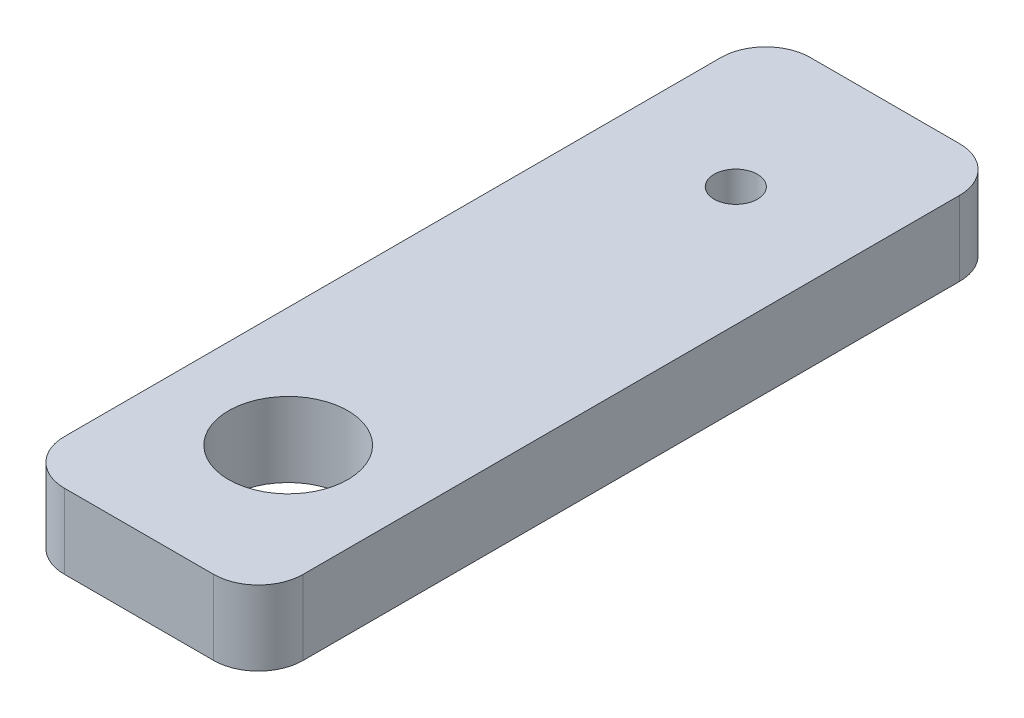
ISO-10303-21;
HEADER;
FILE_DESCRIPTION(('STEP AP214'),'2;1');
FILE_NAME('part.step','',(''),(''),'','','');
FILE_SCHEMA(('AUTOMOTIVE_DESIGN { 1 0 10303 214 1 1 1 1 }'));
ENDSEC;
DATA;
#1=APPLICATION_CONTEXT('core data for automotive mechanical design processes');
#2=APPLICATION_PROTOCOL_DEFINITION('international standard','automotive_design',2000,#1);
#3=PRODUCT_CONTEXT('',#1,'mechanical');
#4=PRODUCT('Part','Part','',(#3));
#5=PRODUCT_RELATED_PRODUCT_CATEGORY('part','',(#4));
#6=PRODUCT_DEFINITION_FORMATION('','',#4);
#7=PRODUCT_DEFINITION_CONTEXT('part definition',#1,'design');
#8=PRODUCT_DEFINITION('design','',#6,#7);
#9=PRODUCT_DEFINITION_SHAPE('','',#8);
#10=(LENGTH_UNIT() NAMED_UNIT(*) SI_UNIT(.MILLI.,.METRE.));
#11=(NAMED_UNIT(*) PLANE_ANGLE_UNIT() SI_UNIT($,.RADIAN.));
#12=(NAMED_UNIT(*) SI_UNIT($,.STERADIAN.) SOLID_ANGLE_UNIT());
#13=UNCERTAINTY_MEASURE_WITH_UNIT(LENGTH_MEASURE(1.E-05),#10,'distance_accuracy_value','');
#14=(GEOMETRIC_REPRESENTATION_CONTEXT(3) GLOBAL_UNCERTAINTY_ASSIGNED_CONTEXT((#13)) GLOBAL_UNIT_ASSIGNED_CONTEXT((#10,
#11,#12)) REPRESENTATION_CONTEXT('',''));
#15=CARTESIAN_POINT('',(0.,0.,0.));
#16=DIRECTION('',(0.,0.,1.));
#17=DIRECTION('',(1.,0.,0.));
#18=AXIS2_PLACEMENT_3D('',#15,#16,#17);
#19=CARTESIAN_POINT('',(0.,5.,0.));
#20=DIRECTION('',(0.,-1.,0.));
#21=DIRECTION('',(0.,0.,-1.));
#22=AXIS2_PLACEMENT_3D('',#19,#20,#21);
#23=PLANE('',#22);
#24=DIRECTION('',(0.,0.,-1.));
#25=VECTOR('',#24,1.);
#26=CARTESIAN_POINT('',(16.,5.,0.));
#27=LINE('',#26,#25);
#28=CARTESIAN_POINT('',(16.,5.,-3.));
#29=VERTEX_POINT('',#28);
#30=CARTESIAN_POINT('',(16.,5.,-47.));
#31=VERTEX_POINT('',#30);
#32=EDGE_CURVE('E164',#29,#31,#27,.T.);
#33=ORIENTED_EDGE('',*,*,#32,.T.);
#34=CARTESIAN_POINT('',(13.,5.,-47.));
#35=DIRECTION('',(0.,-1.,0.));
#36=DIRECTION('',(0.,0.,-1.));
#37=AXIS2_PLACEMENT_3D('',#34,#35,#36);
#38=CIRCLE('',#37,3.);
#39=CARTESIAN_POINT('',(13.,5.,-50.));
#40=VERTEX_POINT('',#39);
#41=EDGE_CURVE('E147',#31,#40,#38,.F.);
#42=ORIENTED_EDGE('',*,*,#41,.T.);
#43=DIRECTION('',(-1.,0.,0.));
#44=VECTOR('',#43,1.);
#45=CARTESIAN_POINT('',(0.,5.,-50.));
#46=LINE('',#45,#44);
#47=CARTESIAN_POINT('',(3.,5.,-50.));
#48=VERTEX_POINT('',#47);
#49=EDGE_CURVE('E118',#40,#48,#46,.T.);
#50=ORIENTED_EDGE('',*,*,#49,.T.);
#51=CARTESIAN_POINT('',(3.,5.,-47.));
#52=DIRECTION('',(0.,-1.,0.));
#53=DIRECTION('',(0.,0.,-1.));
#54=AXIS2_PLACEMENT_3D('',#51,#52,#53);
#55=CIRCLE('',#54,3.);
#56=CARTESIAN_POINT('',(0.,5.,-47.));
#57=VERTEX_POINT('',#56);
#58=EDGE_CURVE('E145',#48,#57,#55,.F.);
#59=ORIENTED_EDGE('',*,*,#58,.T.);
#60=DIRECTION('',(0.,0.,1.));
#61=VECTOR('',#60,1.);
#62=CARTESIAN_POINT('',(0.,5.,0.));
#63=LINE('',#62,#61);
#64=CARTESIAN_POINT('',(0.,5.,-3.));
#65=VERTEX_POINT('',#64);
#66=EDGE_CURVE('E125',#57,#65,#63,.T.);
#67=ORIENTED_EDGE('',*,*,#66,.T.);
#68=CARTESIAN_POINT('',(3.,5.,-3.));
#69=DIRECTION('',(0.,-1.,0.));
#70=DIRECTION('',(0.,0.,-1.));
#71=AXIS2_PLACEMENT_3D('',#68,#69,#70);
#72=CIRCLE('',#71,3.);
#73=CARTESIAN_POINT('',(3.,5.,0.));
#74=VERTEX_POINT('',#73);
#75=EDGE_CURVE('E53',#65,#74,#72,.F.);
#76=ORIENTED_EDGE('',*,*,#75,.T.);
#77=DIRECTION('',(1.,0.,0.));
#78=VECTOR('',#77,1.);
#79=CARTESIAN_POINT('',(0.,5.,0.));
#80=LINE('',#79,#78);
#81=CARTESIAN_POINT('',(13.,5.,0.));
#82=VERTEX_POINT('',#81);
#83=EDGE_CURVE('E128',#74,#82,#80,.T.);
#84=ORIENTED_EDGE('',*,*,#83,.T.);
#85=CARTESIAN_POINT('',(13.,5.,-3.));
#86=DIRECTION('',(0.,-1.,0.));
#87=DIRECTION('',(0.,0.,-1.));
#88=AXIS2_PLACEMENT_3D('',#85,#86,#87);
#89=CIRCLE('',#88,3.);
#90=EDGE_CURVE('E143',#82,#29,#89,.F.);
#91=ORIENTED_EDGE('',*,*,#90,.T.);
#92=EDGE_LOOP('',(#33,#42,#50,#59,#67,#76,#84,#91));
#93=FACE_BOUND('',#92,.T.);
#94=CARTESIAN_POINT('',(8.,5.,-40.));
#95=DIRECTION('',(0.,1.,0.));
#96=DIRECTION('',(0.,0.,1.));
#97=AXIS2_PLACEMENT_3D('',#94,#95,#96);
#98=CIRCLE('',#97,1.45);
#99=CARTESIAN_POINT('',(8.,5.,-38.55));
#100=VERTEX_POINT('',#99);
#101=EDGE_CURVE('E160',#100,#100,#98,.T.);
#102=ORIENTED_EDGE('',*,*,#101,.F.);
#103=EDGE_LOOP('',(#102));
#104=FACE_BOUND('',#103,.T.);
#105=CARTESIAN_POINT('',(8.,5.,-10.));
#106=DIRECTION('',(0.,1.,0.));
#107=DIRECTION('',(0.,0.,1.));
#108=AXIS2_PLACEMENT_3D('',#105,#106,#107);
#109=CIRCLE('',#108,4.);
#110=CARTESIAN_POINT('',(8.,5.,-6.));
#111=VERTEX_POINT('',#110);
#112=EDGE_CURVE('E171',#111,#111,#109,.T.);
#113=ORIENTED_EDGE('',*,*,#112,.F.);
#114=EDGE_LOOP('',(#113));
#115=FACE_BOUND('',#114,.T.);
#116=ADVANCED_FACE('F33',(#93,#104,#115),#23,.F.);
#117=CARTESIAN_POINT('',(0.,0.,0.));
#118=DIRECTION('',(0.,-1.,0.));
#119=DIRECTION('',(0.,0.,-1.));
#120=AXIS2_PLACEMENT_3D('',#117,#118,#119);
#121=PLANE('',#120);
#122=CARTESIAN_POINT('',(8.,0.,-40.));
#123=DIRECTION('',(0.,1.,0.));
#124=DIRECTION('',(0.,0.,1.));
#125=AXIS2_PLACEMENT_3D('',#122,#123,#124);
#126=CIRCLE('',#125,1.45);
#127=CARTESIAN_POINT('',(8.,0.,-38.55));
#128=VERTEX_POINT('',#127);
#129=EDGE_CURVE('E168',#128,#128,#126,.T.);
#130=ORIENTED_EDGE('',*,*,#129,.T.);
#131=EDGE_LOOP('',(#130));
#132=FACE_BOUND('',#131,.T.);
#133=DIRECTION('',(-1.,0.,0.));
#134=VECTOR('',#133,1.);
#135=CARTESIAN_POINT('',(0.,0.,-50.));
#136=LINE('',#135,#134);
#137=CARTESIAN_POINT('',(13.,0.,-50.));
#138=VERTEX_POINT('',#137);
#139=CARTESIAN_POINT('',(3.,0.,-50.));
#140=VERTEX_POINT('',#139);
#141=EDGE_CURVE('E115',#138,#140,#136,.T.);
#142=ORIENTED_EDGE('',*,*,#141,.F.);
#143=CARTESIAN_POINT('',(13.,0.,-47.));
#144=DIRECTION('',(0.,-1.,0.));
#145=DIRECTION('',(0.,0.,-1.));
#146=AXIS2_PLACEMENT_3D('',#143,#144,#145);
#147=CIRCLE('',#146,3.);
#148=CARTESIAN_POINT('',(16.,0.,-47.));
#149=VERTEX_POINT('',#148);
#150=EDGE_CURVE('E98',#138,#149,#147,.T.);
#151=ORIENTED_EDGE('',*,*,#150,.T.);
#152=DIRECTION('',(0.,0.,-1.));
#153=VECTOR('',#152,1.);
#154=CARTESIAN_POINT('',(16.,0.,0.));
#155=LINE('',#154,#153);
#156=CARTESIAN_POINT('',(16.,0.,-3.));
#157=VERTEX_POINT('',#156);
#158=EDGE_CURVE('E126',#157,#149,#155,.T.);
#159=ORIENTED_EDGE('',*,*,#158,.F.);
#160=CARTESIAN_POINT('',(13.,0.,-3.));
#161=DIRECTION('',(0.,-1.,0.));
#162=DIRECTION('',(0.,0.,-1.));
#163=AXIS2_PLACEMENT_3D('',#160,#161,#162);
#164=CIRCLE('',#163,3.);
#165=CARTESIAN_POINT('',(13.,0.,0.));
#166=VERTEX_POINT('',#165);
#167=EDGE_CURVE('E136',#157,#166,#164,.T.);
#168=ORIENTED_EDGE('',*,*,#167,.T.);
#169=DIRECTION('',(1.,0.,0.));
#170=VECTOR('',#169,1.);
#171=CARTESIAN_POINT('',(0.,0.,0.));
#172=LINE('',#171,#170);
#173=CARTESIAN_POINT('',(3.,0.,0.));
#174=VERTEX_POINT('',#173);
#175=EDGE_CURVE('E130',#174,#166,#172,.T.);
#176=ORIENTED_EDGE('',*,*,#175,.F.);
#177=CARTESIAN_POINT('',(3.,0.,-3.));
#178=DIRECTION('',(0.,-1.,0.));
#179=DIRECTION('',(0.,0.,-1.));
#180=AXIS2_PLACEMENT_3D('',#177,#178,#179);
#181=CIRCLE('',#180,3.);
#182=CARTESIAN_POINT('',(0.,0.,-3.));
#183=VERTEX_POINT('',#182);
#184=EDGE_CURVE('E119',#174,#183,#181,.T.);
#185=ORIENTED_EDGE('',*,*,#184,.T.);
#186=DIRECTION('',(0.,0.,1.));
#187=VECTOR('',#186,1.);
#188=CARTESIAN_POINT('',(0.,0.,0.));
#189=LINE('',#188,#187);
#190=CARTESIAN_POINT('',(0.,0.,-47.));
#191=VERTEX_POINT('',#190);
#192=EDGE_CURVE('E159',#191,#183,#189,.T.);
#193=ORIENTED_EDGE('',*,*,#192,.F.);
#194=CARTESIAN_POINT('',(3.,0.,-47.));
#195=DIRECTION('',(0.,-1.,0.));
#196=DIRECTION('',(0.,0.,-1.));
#197=AXIS2_PLACEMENT_3D('',#194,#195,#196);
#198=CIRCLE('',#197,3.);
#199=EDGE_CURVE('E109',#191,#140,#198,.T.);
#200=ORIENTED_EDGE('',*,*,#199,.T.);
#201=EDGE_LOOP('',(#142,#151,#159,#168,#176,#185,#193,#200));
#202=FACE_BOUND('',#201,.T.);
#203=CARTESIAN_POINT('',(8.,0.,-10.));
#204=DIRECTION('',(0.,1.,0.));
#205=DIRECTION('',(0.,0.,1.));
#206=AXIS2_PLACEMENT_3D('',#203,#204,#205);
#207=CIRCLE('',#206,4.);
#208=CARTESIAN_POINT('',(8.,0.,-6.));
#209=VERTEX_POINT('',#208);
#210=EDGE_CURVE('E174',#209,#209,#207,.T.);
#211=ORIENTED_EDGE('',*,*,#210,.T.);
#212=EDGE_LOOP('',(#211));
#213=FACE_BOUND('',#212,.T.);
#214=ADVANCED_FACE('F122',(#132,#202,#213),#121,.T.);
#215=CARTESIAN_POINT('',(0.,5.,0.));
#216=DIRECTION('',(1.,0.,0.));
#217=DIRECTION('',(0.,0.,-1.));
#218=AXIS2_PLACEMENT_3D('',#215,#216,#217);
#219=PLANE('',#218);
#220=ORIENTED_EDGE('',*,*,#66,.F.);
#221=DIRECTION('',(0.,-1.,0.));
#222=VECTOR('',#221,1.);
#223=CARTESIAN_POINT('',(0.,5.,-47.));
#224=LINE('',#223,#222);
#225=EDGE_CURVE('E151',#57,#191,#224,.T.);
#226=ORIENTED_EDGE('',*,*,#225,.T.);
#227=ORIENTED_EDGE('',*,*,#192,.T.);
#228=DIRECTION('',(0.,-1.,0.));
#229=VECTOR('',#228,1.);
#230=CARTESIAN_POINT('',(0.,5.,-3.));
#231=LINE('',#230,#229);
#232=EDGE_CURVE('E149',#183,#65,#231,.F.);
#233=ORIENTED_EDGE('',*,*,#232,.T.);
#234=EDGE_LOOP('',(#220,#226,#227,#233));
#235=FACE_BOUND('',#234,.T.);
#236=ADVANCED_FACE('F188',(#235),#219,.F.);
#237=CARTESIAN_POINT('',(0.,5.,0.));
#238=DIRECTION('',(0.,0.,-1.));
#239=DIRECTION('',(-1.,0.,0.));
#240=AXIS2_PLACEMENT_3D('',#237,#238,#239);
#241=PLANE('',#240);
#242=ORIENTED_EDGE('',*,*,#175,.T.);
#243=DIRECTION('',(0.,-1.,0.));
#244=VECTOR('',#243,1.);
#245=CARTESIAN_POINT('',(13.,5.,0.));
#246=LINE('',#245,#244);
#247=EDGE_CURVE('E11',#166,#82,#246,.F.);
#248=ORIENTED_EDGE('',*,*,#247,.T.);
#249=ORIENTED_EDGE('',*,*,#83,.F.);
#250=DIRECTION('',(0.,-1.,0.));
#251=VECTOR('',#250,1.);
#252=CARTESIAN_POINT('',(3.,5.,0.));
#253=LINE('',#252,#251);
#254=EDGE_CURVE('E41',#74,#174,#253,.T.);
#255=ORIENTED_EDGE('',*,*,#254,.T.);
#256=EDGE_LOOP('',(#242,#248,#249,#255));
#257=FACE_BOUND('',#256,.T.);
#258=ADVANCED_FACE('F156',(#257),#241,.F.);
#259=CARTESIAN_POINT('',(16.,5.,0.));
#260=DIRECTION('',(-1.,0.,0.));
#261=DIRECTION('',(0.,0.,1.));
#262=AXIS2_PLACEMENT_3D('',#259,#260,#261);
#263=PLANE('',#262);
#264=ORIENTED_EDGE('',*,*,#158,.T.);
#265=DIRECTION('',(0.,-1.,0.));
#266=VECTOR('',#265,1.);
#267=CARTESIAN_POINT('',(16.,5.,-47.));
#268=LINE('',#267,#266);
#269=EDGE_CURVE('E103',#149,#31,#268,.F.);
#270=ORIENTED_EDGE('',*,*,#269,.T.);
#271=ORIENTED_EDGE('',*,*,#32,.F.);
#272=DIRECTION('',(0.,-1.,0.));
#273=VECTOR('',#272,1.);
#274=CARTESIAN_POINT('',(16.,5.,-3.));
#275=LINE('',#274,#273);
#276=EDGE_CURVE('E108',#29,#157,#275,.T.);
#277=ORIENTED_EDGE('',*,*,#276,.T.);
#278=EDGE_LOOP('',(#264,#270,#271,#277));
#279=FACE_BOUND('',#278,.T.);
#280=ADVANCED_FACE('F198',(#279),#263,.F.);
#281=CARTESIAN_POINT('',(0.,5.,-50.));
#282=DIRECTION('',(0.,0.,1.));
#283=DIRECTION('',(1.,0.,0.));
#284=AXIS2_PLACEMENT_3D('',#281,#282,#283);
#285=PLANE('',#284);
#286=ORIENTED_EDGE('',*,*,#49,.F.);
#287=DIRECTION('',(0.,-1.,0.));
#288=VECTOR('',#287,1.);
#289=CARTESIAN_POINT('',(13.,5.,-50.));
#290=LINE('',#289,#288);
#291=EDGE_CURVE('E102',#40,#138,#290,.T.);
#292=ORIENTED_EDGE('',*,*,#291,.T.);
#293=ORIENTED_EDGE('',*,*,#141,.T.);
#294=DIRECTION('',(0.,-1.,0.));
#295=VECTOR('',#294,1.);
#296=CARTESIAN_POINT('',(3.,5.,-50.));
#297=LINE('',#296,#295);
#298=EDGE_CURVE('E120',#140,#48,#297,.F.);
#299=ORIENTED_EDGE('',*,*,#298,.T.);
#300=EDGE_LOOP('',(#286,#292,#293,#299));
#301=FACE_BOUND('',#300,.T.);
#302=ADVANCED_FACE('F114',(#301),#285,.F.);
#303=CARTESIAN_POINT('',(8.,5.,-40.));
#304=DIRECTION('',(0.,-1.,0.));
#305=DIRECTION('',(0.,0.,-1.));
#306=AXIS2_PLACEMENT_3D('',#303,#304,#305);
#307=CYLINDRICAL_SURFACE('',#306,1.45);
#308=ORIENTED_EDGE('',*,*,#101,.T.);
#309=EDGE_LOOP('',(#308));
#310=FACE_BOUND('',#309,.T.);
#311=ORIENTED_EDGE('',*,*,#129,.F.);
#312=EDGE_LOOP('',(#311));
#313=FACE_BOUND('',#312,.T.);
#314=ADVANCED_FACE('F193',(#310,#313),#307,.F.);
#315=CARTESIAN_POINT('',(8.,5.,-10.));
#316=DIRECTION('',(0.,-1.,0.));
#317=DIRECTION('',(0.,0.,-1.));
#318=AXIS2_PLACEMENT_3D('',#315,#316,#317);
#319=CYLINDRICAL_SURFACE('',#318,4.);
#320=ORIENTED_EDGE('',*,*,#112,.T.);
#321=EDGE_LOOP('',(#320));
#322=FACE_BOUND('',#321,.T.);
#323=ORIENTED_EDGE('',*,*,#210,.F.);
#324=EDGE_LOOP('',(#323));
#325=FACE_BOUND('',#324,.T.);
#326=ADVANCED_FACE('F180',(#322,#325),#319,.F.);
#327=CARTESIAN_POINT('',(13.,5.,-47.));
#328=DIRECTION('',(0.,-1.,0.));
#329=DIRECTION('',(0.,0.,-1.));
#330=AXIS2_PLACEMENT_3D('',#327,#328,#329);
#331=CYLINDRICAL_SURFACE('',#330,3.);
#332=ORIENTED_EDGE('',*,*,#41,.F.);
#333=ORIENTED_EDGE('',*,*,#269,.F.);
#334=ORIENTED_EDGE('',*,*,#150,.F.);
#335=ORIENTED_EDGE('',*,*,#291,.F.);
#336=EDGE_LOOP('',(#332,#333,#334,#335));
#337=FACE_BOUND('',#336,.T.);
#338=ADVANCED_FACE('F101',(#337),#331,.T.);
#339=CARTESIAN_POINT('',(3.,5.,-47.));
#340=DIRECTION('',(0.,-1.,0.));
#341=DIRECTION('',(0.,0.,-1.));
#342=AXIS2_PLACEMENT_3D('',#339,#340,#341);
#343=CYLINDRICAL_SURFACE('',#342,3.);
#344=ORIENTED_EDGE('',*,*,#58,.F.);
#345=ORIENTED_EDGE('',*,*,#298,.F.);
#346=ORIENTED_EDGE('',*,*,#199,.F.);
#347=ORIENTED_EDGE('',*,*,#225,.F.);
#348=EDGE_LOOP('',(#344,#345,#346,#347));
#349=FACE_BOUND('',#348,.T.);
#350=ADVANCED_FACE('F209',(#349),#343,.T.);
#351=CARTESIAN_POINT('',(13.,5.,-3.));
#352=DIRECTION('',(0.,-1.,0.));
#353=DIRECTION('',(0.,0.,-1.));
#354=AXIS2_PLACEMENT_3D('',#351,#352,#353);
#355=CYLINDRICAL_SURFACE('',#354,3.);
#356=ORIENTED_EDGE('',*,*,#90,.F.);
#357=ORIENTED_EDGE('',*,*,#247,.F.);
#358=ORIENTED_EDGE('',*,*,#167,.F.);
#359=ORIENTED_EDGE('',*,*,#276,.F.);
#360=EDGE_LOOP('',(#356,#357,#358,#359));
#361=FACE_BOUND('',#360,.T.);
#362=ADVANCED_FACE('F211',(#361),#355,.T.);
#363=CARTESIAN_POINT('',(3.,5.,-3.));
#364=DIRECTION('',(0.,-1.,0.));
#365=DIRECTION('',(0.,0.,-1.));
#366=AXIS2_PLACEMENT_3D('',#363,#364,#365);
#367=CYLINDRICAL_SURFACE('',#366,3.);
#368=ORIENTED_EDGE('',*,*,#75,.F.);
#369=ORIENTED_EDGE('',*,*,#232,.F.);
#370=ORIENTED_EDGE('',*,*,#184,.F.);
#371=ORIENTED_EDGE('',*,*,#254,.F.);
#372=EDGE_LOOP('',(#368,#369,#370,#371));
#373=FACE_BOUND('',#372,.T.);
#374=ADVANCED_FACE('F35',(#373),#367,.T.);
#375=CLOSED_SHELL('',(#116,#214,#236,#258,#280,#302,#314,#326,#338,#350,#362,#374));
#376=MANIFOLD_SOLID_BREP('B2',#375);
#377=ADVANCED_BREP_SHAPE_REPRESENTATION('',(#18,#376),#14);
#378=SHAPE_DEFINITION_REPRESENTATION(#9,#377);
ENDSEC;
END-ISO-10303-21;
